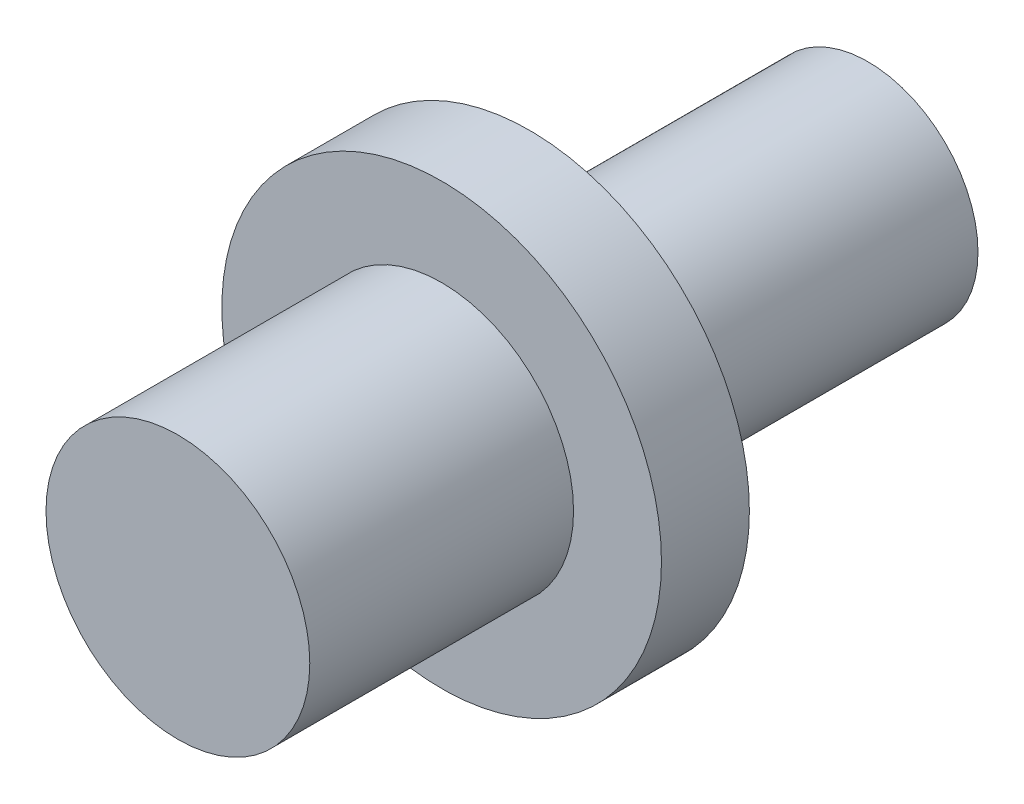
ISO-10303-21;
HEADER;
FILE_DESCRIPTION(('STEP AP214'),'2;1');
FILE_NAME('part.step','',(''),(''),'','','');
FILE_SCHEMA(('AUTOMOTIVE_DESIGN { 1 0 10303 214 1 1 1 1 }'));
ENDSEC;
DATA;
#1=APPLICATION_CONTEXT('core data for automotive mechanical design processes');
#2=APPLICATION_PROTOCOL_DEFINITION('international standard','automotive_design',2000,#1);
#3=PRODUCT_CONTEXT('',#1,'mechanical');
#4=PRODUCT('Part','Part','',(#3));
#5=PRODUCT_RELATED_PRODUCT_CATEGORY('part','',(#4));
#6=PRODUCT_DEFINITION_FORMATION('','',#4);
#7=PRODUCT_DEFINITION_CONTEXT('part definition',#1,'design');
#8=PRODUCT_DEFINITION('design','',#6,#7);
#9=PRODUCT_DEFINITION_SHAPE('','',#8);
#10=(LENGTH_UNIT() NAMED_UNIT(*) SI_UNIT(.MILLI.,.METRE.));
#11=(NAMED_UNIT(*) PLANE_ANGLE_UNIT() SI_UNIT($,.RADIAN.));
#12=(NAMED_UNIT(*) SI_UNIT($,.STERADIAN.) SOLID_ANGLE_UNIT());
#13=UNCERTAINTY_MEASURE_WITH_UNIT(LENGTH_MEASURE(1.E-05),#10,'distance_accuracy_value','');
#14=(GEOMETRIC_REPRESENTATION_CONTEXT(3) GLOBAL_UNCERTAINTY_ASSIGNED_CONTEXT((#13)) GLOBAL_UNIT_ASSIGNED_CONTEXT((#10,
#11,#12)) REPRESENTATION_CONTEXT('',''));
#15=CARTESIAN_POINT('',(0.,0.,0.));
#16=DIRECTION('',(0.,0.,1.));
#17=DIRECTION('',(1.,0.,0.));
#18=AXIS2_PLACEMENT_3D('',#15,#16,#17);
#19=CARTESIAN_POINT('',(0.,0.,0.));
#20=DIRECTION('',(0.,0.,-1.));
#21=DIRECTION('',(-1.,0.,0.));
#22=AXIS2_PLACEMENT_3D('',#19,#20,#21);
#23=PLANE('',#22);
#24=CARTESIAN_POINT('',(0.,0.,0.));
#25=DIRECTION('',(0.,0.,1.));
#26=DIRECTION('',(1.,0.,0.));
#27=AXIS2_PLACEMENT_3D('',#24,#25,#26);
#28=CIRCLE('',#27,3.);
#29=CARTESIAN_POINT('',(3.,0.,0.));
#30=VERTEX_POINT('',#29);
#31=EDGE_CURVE('E10',#30,#30,#28,.T.);
#32=ORIENTED_EDGE('',*,*,#31,.T.);
#33=EDGE_LOOP('',(#32));
#34=FACE_BOUND('',#33,.T.);
#35=ADVANCED_FACE('F31',(#34),#23,.F.);
#36=CARTESIAN_POINT('',(0.,0.,0.));
#37=DIRECTION('',(0.,0.,1.));
#38=DIRECTION('',(1.,0.,0.));
#39=AXIS2_PLACEMENT_3D('',#36,#37,#38);
#40=CYLINDRICAL_SURFACE('',#39,3.);
#41=ORIENTED_EDGE('',*,*,#31,.F.);
#42=EDGE_LOOP('',(#41));
#43=FACE_BOUND('',#42,.T.);
#44=CARTESIAN_POINT('',(0.,0.,-6.));
#45=DIRECTION('',(0.,0.,1.));
#46=DIRECTION('',(1.,0.,0.));
#47=AXIS2_PLACEMENT_3D('',#44,#45,#46);
#48=CIRCLE('',#47,3.);
#49=CARTESIAN_POINT('',(3.,0.,-6.));
#50=VERTEX_POINT('',#49);
#51=EDGE_CURVE('E37',#50,#50,#48,.T.);
#52=ORIENTED_EDGE('',*,*,#51,.T.);
#53=EDGE_LOOP('',(#52));
#54=FACE_BOUND('',#53,.T.);
#55=ADVANCED_FACE('F69',(#43,#54),#40,.T.);
#56=CARTESIAN_POINT('',(0.,3.,-6.));
#57=DIRECTION('',(0.,0.,-1.));
#58=DIRECTION('',(-1.,0.,0.));
#59=AXIS2_PLACEMENT_3D('',#56,#57,#58);
#60=PLANE('',#59);
#61=ORIENTED_EDGE('',*,*,#51,.F.);
#62=EDGE_LOOP('',(#61));
#63=FACE_BOUND('',#62,.T.);
#64=CARTESIAN_POINT('',(0.,0.,-6.));
#65=DIRECTION('',(0.,0.,1.));
#66=DIRECTION('',(1.,0.,0.));
#67=AXIS2_PLACEMENT_3D('',#64,#65,#66);
#68=CIRCLE('',#67,5.);
#69=CARTESIAN_POINT('',(5.,0.,-6.));
#70=VERTEX_POINT('',#69);
#71=EDGE_CURVE('E41',#70,#70,#68,.T.);
#72=ORIENTED_EDGE('',*,*,#71,.T.);
#73=EDGE_LOOP('',(#72));
#74=FACE_BOUND('',#73,.T.);
#75=ADVANCED_FACE('F73',(#63,#74),#60,.F.);
#76=CARTESIAN_POINT('',(0.,0.,0.));
#77=DIRECTION('',(0.,0.,1.));
#78=DIRECTION('',(1.,0.,0.));
#79=AXIS2_PLACEMENT_3D('',#76,#77,#78);
#80=CYLINDRICAL_SURFACE('',#79,5.);
#81=ORIENTED_EDGE('',*,*,#71,.F.);
#82=EDGE_LOOP('',(#81));
#83=FACE_BOUND('',#82,.T.);
#84=CARTESIAN_POINT('',(0.,0.,-8.));
#85=DIRECTION('',(0.,0.,1.));
#86=DIRECTION('',(1.,0.,0.));
#87=AXIS2_PLACEMENT_3D('',#84,#85,#86);
#88=CIRCLE('',#87,5.);
#89=CARTESIAN_POINT('',(5.,0.,-8.));
#90=VERTEX_POINT('',#89);
#91=EDGE_CURVE('E45',#90,#90,#88,.T.);
#92=ORIENTED_EDGE('',*,*,#91,.T.);
#93=EDGE_LOOP('',(#92));
#94=FACE_BOUND('',#93,.T.);
#95=ADVANCED_FACE('F78',(#83,#94),#80,.T.);
#96=CARTESIAN_POINT('',(0.,5.,-8.));
#97=DIRECTION('',(0.,0.,1.));
#98=DIRECTION('',(1.,0.,0.));
#99=AXIS2_PLACEMENT_3D('',#96,#97,#98);
#100=PLANE('',#99);
#101=ORIENTED_EDGE('',*,*,#91,.F.);
#102=EDGE_LOOP('',(#101));
#103=FACE_BOUND('',#102,.T.);
#104=CARTESIAN_POINT('',(0.,0.,-8.));
#105=DIRECTION('',(0.,0.,1.));
#106=DIRECTION('',(1.,0.,0.));
#107=AXIS2_PLACEMENT_3D('',#104,#105,#106);
#108=CIRCLE('',#107,2.5);
#109=CARTESIAN_POINT('',(2.5,0.,-8.));
#110=VERTEX_POINT('',#109);
#111=EDGE_CURVE('E50',#110,#110,#108,.T.);
#112=ORIENTED_EDGE('',*,*,#111,.T.);
#113=EDGE_LOOP('',(#112));
#114=FACE_BOUND('',#113,.T.);
#115=ADVANCED_FACE('F65',(#103,#114),#100,.F.);
#116=CARTESIAN_POINT('',(0.,0.,0.));
#117=DIRECTION('',(0.,0.,1.));
#118=DIRECTION('',(1.,0.,0.));
#119=AXIS2_PLACEMENT_3D('',#116,#117,#118);
#120=CYLINDRICAL_SURFACE('',#119,2.5);
#121=ORIENTED_EDGE('',*,*,#111,.F.);
#122=EDGE_LOOP('',(#121));
#123=FACE_BOUND('',#122,.T.);
#124=CARTESIAN_POINT('',(0.,0.,-15.7));
#125=DIRECTION('',(0.,0.,1.));
#126=DIRECTION('',(1.,0.,0.));
#127=AXIS2_PLACEMENT_3D('',#124,#125,#126);
#128=CIRCLE('',#127,2.5);
#129=CARTESIAN_POINT('',(2.5,0.,-15.7));
#130=VERTEX_POINT('',#129);
#131=EDGE_CURVE('E53',#130,#130,#128,.T.);
#132=ORIENTED_EDGE('',*,*,#131,.T.);
#133=EDGE_LOOP('',(#132));
#134=FACE_BOUND('',#133,.T.);
#135=ADVANCED_FACE('F57',(#123,#134),#120,.T.);
#136=CARTESIAN_POINT('',(0.,2.5,-15.7));
#137=DIRECTION('',(0.,0.,1.));
#138=DIRECTION('',(1.,0.,0.));
#139=AXIS2_PLACEMENT_3D('',#136,#137,#138);
#140=PLANE('',#139);
#141=ORIENTED_EDGE('',*,*,#131,.F.);
#142=EDGE_LOOP('',(#141));
#143=FACE_BOUND('',#142,.T.);
#144=ADVANCED_FACE('F59',(#143),#140,.F.);
#145=CLOSED_SHELL('',(#35,#55,#75,#95,#115,#135,#144));
#146=MANIFOLD_SOLID_BREP('B2',#145);
#147=ADVANCED_BREP_SHAPE_REPRESENTATION('',(#18,#146),#14);
#148=SHAPE_DEFINITION_REPRESENTATION(#9,#147);
ENDSEC;
END-ISO-10303-21;
